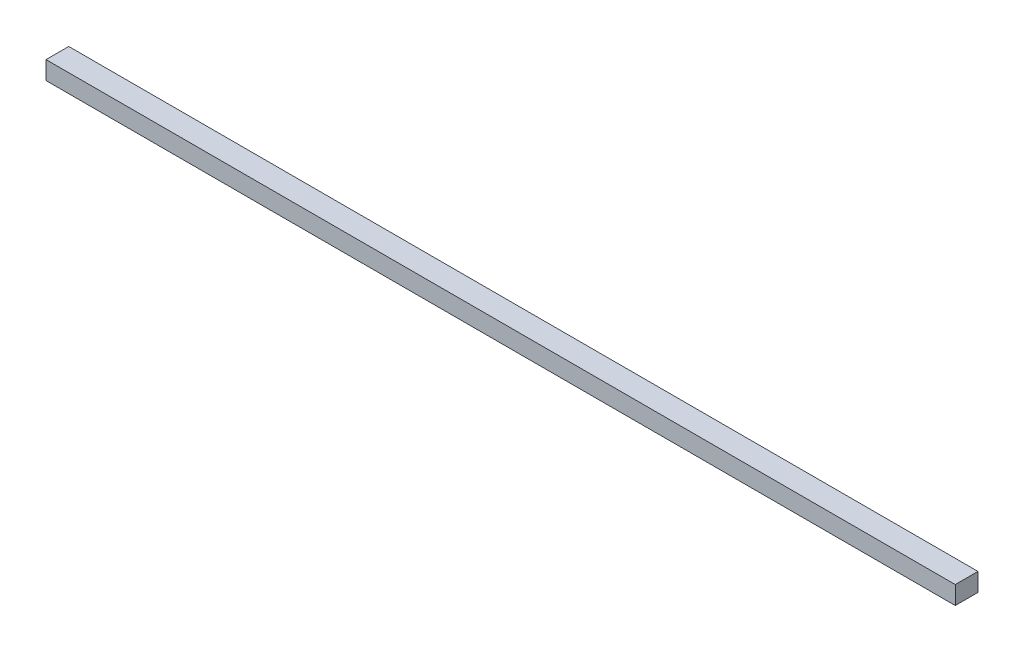
ISO-10303-21;
HEADER;
FILE_DESCRIPTION(('STEP AP214'),'2;1');
FILE_NAME('part.step','',(''),(''),'','','');
FILE_SCHEMA(('AUTOMOTIVE_DESIGN { 1 0 10303 214 1 1 1 1 }'));
ENDSEC;
DATA;
#1=APPLICATION_CONTEXT('core data for automotive mechanical design processes');
#2=APPLICATION_PROTOCOL_DEFINITION('international standard','automotive_design',2000,#1);
#3=PRODUCT_CONTEXT('',#1,'mechanical');
#4=PRODUCT('Part','Part','',(#3));
#5=PRODUCT_RELATED_PRODUCT_CATEGORY('part','',(#4));
#6=PRODUCT_DEFINITION_FORMATION('','',#4);
#7=PRODUCT_DEFINITION_CONTEXT('part definition',#1,'design');
#8=PRODUCT_DEFINITION('design','',#6,#7);
#9=PRODUCT_DEFINITION_SHAPE('','',#8);
#10=(LENGTH_UNIT() NAMED_UNIT(*) SI_UNIT(.MILLI.,.METRE.));
#11=(NAMED_UNIT(*) PLANE_ANGLE_UNIT() SI_UNIT($,.RADIAN.));
#12=(NAMED_UNIT(*) SI_UNIT($,.STERADIAN.) SOLID_ANGLE_UNIT());
#13=UNCERTAINTY_MEASURE_WITH_UNIT(LENGTH_MEASURE(1.E-05),#10,'distance_accuracy_value','');
#14=(GEOMETRIC_REPRESENTATION_CONTEXT(3) GLOBAL_UNCERTAINTY_ASSIGNED_CONTEXT((#13)) GLOBAL_UNIT_ASSIGNED_CONTEXT((#10,
#11,#12)) REPRESENTATION_CONTEXT('',''));
#15=CARTESIAN_POINT('',(0.,0.,0.));
#16=DIRECTION('',(0.,0.,1.));
#17=DIRECTION('',(1.,0.,0.));
#18=AXIS2_PLACEMENT_3D('',#15,#16,#17);
#19=CARTESIAN_POINT('',(800.,0.,0.));
#20=DIRECTION('',(0.,0.,1.));
#21=DIRECTION('',(1.,0.,0.));
#22=AXIS2_PLACEMENT_3D('',#19,#20,#21);
#23=PLANE('',#22);
#24=DIRECTION('',(0.,1.,0.));
#25=VECTOR('',#24,1.);
#26=CARTESIAN_POINT('',(0.,0.,0.));
#27=LINE('',#26,#25);
#28=CARTESIAN_POINT('',(0.,0.,0.));
#29=VERTEX_POINT('',#28);
#30=CARTESIAN_POINT('',(0.,16.,0.));
#31=VERTEX_POINT('',#30);
#32=EDGE_CURVE('E98',#29,#31,#27,.T.);
#33=ORIENTED_EDGE('',*,*,#32,.T.);
#34=DIRECTION('',(-1.,0.,0.));
#35=VECTOR('',#34,1.);
#36=CARTESIAN_POINT('',(800.,16.,0.));
#37=LINE('',#36,#35);
#38=CARTESIAN_POINT('',(800.,16.,0.));
#39=VERTEX_POINT('',#38);
#40=EDGE_CURVE('E11',#39,#31,#37,.T.);
#41=ORIENTED_EDGE('',*,*,#40,.F.);
#42=DIRECTION('',(0.,1.,0.));
#43=VECTOR('',#42,1.);
#44=CARTESIAN_POINT('',(800.,0.,0.));
#45=LINE('',#44,#43);
#46=CARTESIAN_POINT('',(800.,0.,0.));
#47=VERTEX_POINT('',#46);
#48=EDGE_CURVE('E86',#47,#39,#45,.T.);
#49=ORIENTED_EDGE('',*,*,#48,.F.);
#50=DIRECTION('',(-1.,0.,0.));
#51=VECTOR('',#50,1.);
#52=CARTESIAN_POINT('',(800.,0.,0.));
#53=LINE('',#52,#51);
#54=EDGE_CURVE('E94',#47,#29,#53,.T.);
#55=ORIENTED_EDGE('',*,*,#54,.T.);
#56=EDGE_LOOP('',(#33,#41,#49,#55));
#57=FACE_BOUND('',#56,.T.);
#58=ADVANCED_FACE('F35',(#57),#23,.F.);
#59=CARTESIAN_POINT('',(800.,16.,0.));
#60=DIRECTION('',(0.,-1.,0.));
#61=DIRECTION('',(0.,0.,-1.));
#62=AXIS2_PLACEMENT_3D('',#59,#60,#61);
#63=PLANE('',#62);
#64=DIRECTION('',(0.,0.,1.));
#65=VECTOR('',#64,1.);
#66=CARTESIAN_POINT('',(0.,16.,0.));
#67=LINE('',#66,#65);
#68=CARTESIAN_POINT('',(0.,16.,20.));
#69=VERTEX_POINT('',#68);
#70=EDGE_CURVE('E90',#31,#69,#67,.T.);
#71=ORIENTED_EDGE('',*,*,#70,.T.);
#72=DIRECTION('',(-1.,0.,0.));
#73=VECTOR('',#72,1.);
#74=CARTESIAN_POINT('',(800.,16.,20.));
#75=LINE('',#74,#73);
#76=CARTESIAN_POINT('',(800.,16.,20.));
#77=VERTEX_POINT('',#76);
#78=EDGE_CURVE('E43',#77,#69,#75,.T.);
#79=ORIENTED_EDGE('',*,*,#78,.F.);
#80=DIRECTION('',(0.,0.,1.));
#81=VECTOR('',#80,1.);
#82=CARTESIAN_POINT('',(800.,16.,0.));
#83=LINE('',#82,#81);
#84=EDGE_CURVE('E81',#39,#77,#83,.T.);
#85=ORIENTED_EDGE('',*,*,#84,.F.);
#86=ORIENTED_EDGE('',*,*,#40,.T.);
#87=EDGE_LOOP('',(#71,#79,#85,#86));
#88=FACE_BOUND('',#87,.T.);
#89=ADVANCED_FACE('F89',(#88),#63,.F.);
#90=CARTESIAN_POINT('',(800.,0.,20.));
#91=DIRECTION('',(0.,0.,-1.));
#92=DIRECTION('',(-1.,0.,0.));
#93=AXIS2_PLACEMENT_3D('',#90,#91,#92);
#94=PLANE('',#93);
#95=DIRECTION('',(0.,-1.,0.));
#96=VECTOR('',#95,1.);
#97=CARTESIAN_POINT('',(0.,0.,20.));
#98=LINE('',#97,#96);
#99=CARTESIAN_POINT('',(0.,0.,20.));
#100=VERTEX_POINT('',#99);
#101=EDGE_CURVE('E68',#69,#100,#98,.T.);
#102=ORIENTED_EDGE('',*,*,#101,.T.);
#103=DIRECTION('',(-1.,0.,0.));
#104=VECTOR('',#103,1.);
#105=CARTESIAN_POINT('',(800.,0.,20.));
#106=LINE('',#105,#104);
#107=CARTESIAN_POINT('',(800.,0.,20.));
#108=VERTEX_POINT('',#107);
#109=EDGE_CURVE('E91',#108,#100,#106,.T.);
#110=ORIENTED_EDGE('',*,*,#109,.F.);
#111=DIRECTION('',(0.,-1.,0.));
#112=VECTOR('',#111,1.);
#113=CARTESIAN_POINT('',(800.,0.,20.));
#114=LINE('',#113,#112);
#115=EDGE_CURVE('E84',#77,#108,#114,.T.);
#116=ORIENTED_EDGE('',*,*,#115,.F.);
#117=ORIENTED_EDGE('',*,*,#78,.T.);
#118=EDGE_LOOP('',(#102,#110,#116,#117));
#119=FACE_BOUND('',#118,.T.);
#120=ADVANCED_FACE('F92',(#119),#94,.F.);
#121=CARTESIAN_POINT('',(800.,0.,0.));
#122=DIRECTION('',(0.,1.,0.));
#123=DIRECTION('',(0.,0.,1.));
#124=AXIS2_PLACEMENT_3D('',#121,#122,#123);
#125=PLANE('',#124);
#126=DIRECTION('',(0.,0.,-1.));
#127=VECTOR('',#126,1.);
#128=CARTESIAN_POINT('',(0.,0.,0.));
#129=LINE('',#128,#127);
#130=EDGE_CURVE('E74',#100,#29,#129,.T.);
#131=ORIENTED_EDGE('',*,*,#130,.T.);
#132=ORIENTED_EDGE('',*,*,#54,.F.);
#133=DIRECTION('',(0.,0.,-1.));
#134=VECTOR('',#133,1.);
#135=CARTESIAN_POINT('',(800.,0.,0.));
#136=LINE('',#135,#134);
#137=EDGE_CURVE('E51',#108,#47,#136,.T.);
#138=ORIENTED_EDGE('',*,*,#137,.F.);
#139=ORIENTED_EDGE('',*,*,#109,.T.);
#140=EDGE_LOOP('',(#131,#132,#138,#139));
#141=FACE_BOUND('',#140,.T.);
#142=ADVANCED_FACE('F105',(#141),#125,.F.);
#143=CARTESIAN_POINT('',(800.,0.,0.));
#144=DIRECTION('',(1.,0.,0.));
#145=DIRECTION('',(0.,0.,-1.));
#146=AXIS2_PLACEMENT_3D('',#143,#144,#145);
#147=PLANE('',#146);
#148=ORIENTED_EDGE('',*,*,#48,.T.);
#149=ORIENTED_EDGE('',*,*,#84,.T.);
#150=ORIENTED_EDGE('',*,*,#115,.T.);
#151=ORIENTED_EDGE('',*,*,#137,.T.);
#152=EDGE_LOOP('',(#148,#149,#150,#151));
#153=FACE_BOUND('',#152,.T.);
#154=ADVANCED_FACE('F82',(#153),#147,.T.);
#155=CARTESIAN_POINT('',(0.,0.,0.));
#156=DIRECTION('',(1.,0.,0.));
#157=DIRECTION('',(0.,0.,-1.));
#158=AXIS2_PLACEMENT_3D('',#155,#156,#157);
#159=PLANE('',#158);
#160=ORIENTED_EDGE('',*,*,#32,.F.);
#161=ORIENTED_EDGE('',*,*,#130,.F.);
#162=ORIENTED_EDGE('',*,*,#101,.F.);
#163=ORIENTED_EDGE('',*,*,#70,.F.);
#164=EDGE_LOOP('',(#160,#161,#162,#163));
#165=FACE_BOUND('',#164,.T.);
#166=ADVANCED_FACE('F108',(#165),#159,.F.);
#167=CLOSED_SHELL('',(#58,#89,#120,#142,#154,#166));
#168=MANIFOLD_SOLID_BREP('B2',#167);
#169=ADVANCED_BREP_SHAPE_REPRESENTATION('',(#18,#168),#14);
#170=SHAPE_DEFINITION_REPRESENTATION(#9,#169);
ENDSEC;
END-ISO-10303-21;
